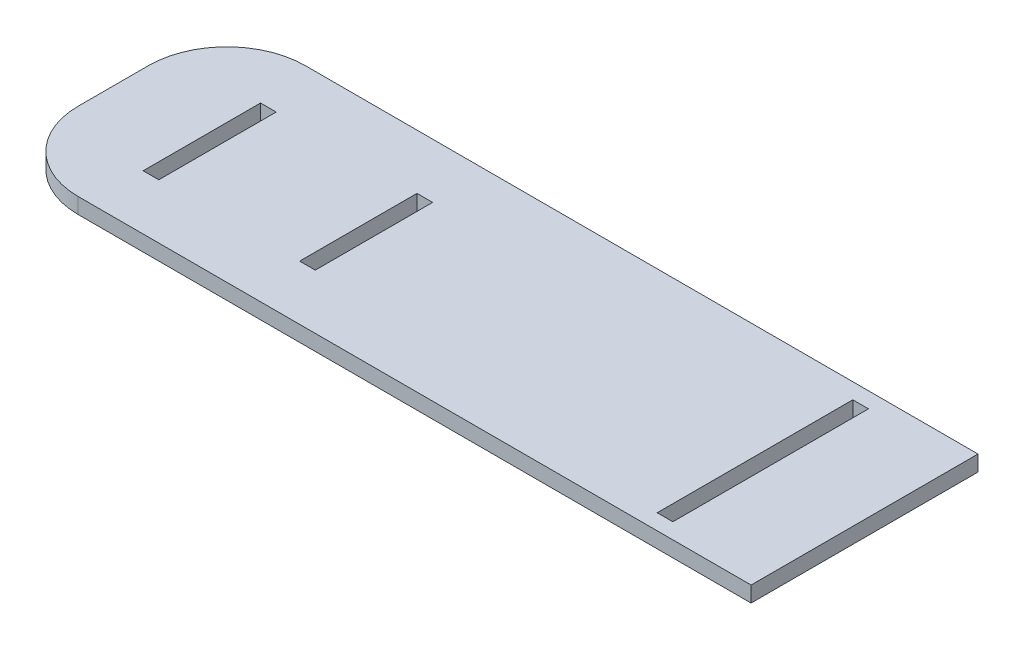
ISO-10303-21;
HEADER;
FILE_DESCRIPTION(('STEP AP214'),'2;1');
FILE_NAME('part.step','',(''),(''),'','','');
FILE_SCHEMA(('AUTOMOTIVE_DESIGN { 1 0 10303 214 1 1 1 1 }'));
ENDSEC;
DATA;
#1=APPLICATION_CONTEXT('core data for automotive mechanical design processes');
#2=APPLICATION_PROTOCOL_DEFINITION('international standard','automotive_design',2000,#1);
#3=PRODUCT_CONTEXT('',#1,'mechanical');
#4=PRODUCT('Part','Part','',(#3));
#5=PRODUCT_RELATED_PRODUCT_CATEGORY('part','',(#4));
#6=PRODUCT_DEFINITION_FORMATION('','',#4);
#7=PRODUCT_DEFINITION_CONTEXT('part definition',#1,'design');
#8=PRODUCT_DEFINITION('design','',#6,#7);
#9=PRODUCT_DEFINITION_SHAPE('','',#8);
#10=(LENGTH_UNIT() NAMED_UNIT(*) SI_UNIT(.MILLI.,.METRE.));
#11=(NAMED_UNIT(*) PLANE_ANGLE_UNIT() SI_UNIT($,.RADIAN.));
#12=(NAMED_UNIT(*) SI_UNIT($,.STERADIAN.) SOLID_ANGLE_UNIT());
#13=UNCERTAINTY_MEASURE_WITH_UNIT(LENGTH_MEASURE(1.E-05),#10,'distance_accuracy_value','');
#14=(GEOMETRIC_REPRESENTATION_CONTEXT(3) GLOBAL_UNCERTAINTY_ASSIGNED_CONTEXT((#13)) GLOBAL_UNIT_ASSIGNED_CONTEXT((#10,
#11,#12)) REPRESENTATION_CONTEXT('',''));
#15=CARTESIAN_POINT('',(0.,0.,0.));
#16=DIRECTION('',(0.,0.,1.));
#17=DIRECTION('',(1.,0.,0.));
#18=AXIS2_PLACEMENT_3D('',#15,#16,#17);
#19=CARTESIAN_POINT('',(0.,20.,145.));
#20=DIRECTION('',(-1.,0.,0.));
#21=DIRECTION('',(0.,0.,1.));
#22=AXIS2_PLACEMENT_3D('',#19,#20,#21);
#23=PLANE('',#22);
#24=DIRECTION('',(0.,0.,-1.));
#25=VECTOR('',#24,1.);
#26=CARTESIAN_POINT('',(0.,0.,145.));
#27=LINE('',#26,#25);
#28=CARTESIAN_POINT('',(0.,0.,145.));
#29=VERTEX_POINT('',#28);
#30=CARTESIAN_POINT('',(-1.54871412423962E-13,0.,-145.));
#31=VERTEX_POINT('',#30);
#32=EDGE_CURVE('E219',#29,#31,#27,.T.);
#33=ORIENTED_EDGE('',*,*,#32,.T.);
#34=DIRECTION('',(0.,-1.,0.));
#35=VECTOR('',#34,1.);
#36=CARTESIAN_POINT('',(-1.54871412423962E-13,20.,-145.));
#37=LINE('',#36,#35);
#38=CARTESIAN_POINT('',(-1.54871412423962E-13,20.,-145.));
#39=VERTEX_POINT('',#38);
#40=EDGE_CURVE('E339',#39,#31,#37,.T.);
#41=ORIENTED_EDGE('',*,*,#40,.F.);
#42=DIRECTION('',(0.,0.,-1.));
#43=VECTOR('',#42,1.);
#44=CARTESIAN_POINT('',(0.,20.,145.));
#45=LINE('',#44,#43);
#46=CARTESIAN_POINT('',(0.,20.,145.));
#47=VERTEX_POINT('',#46);
#48=EDGE_CURVE('E306',#47,#39,#45,.T.);
#49=ORIENTED_EDGE('',*,*,#48,.F.);
#50=DIRECTION('',(0.,-1.,0.));
#51=VECTOR('',#50,1.);
#52=CARTESIAN_POINT('',(0.,20.,145.));
#53=LINE('',#52,#51);
#54=EDGE_CURVE('E322',#47,#29,#53,.T.);
#55=ORIENTED_EDGE('',*,*,#54,.T.);
#56=EDGE_LOOP('',(#33,#41,#49,#55));
#57=FACE_BOUND('',#56,.T.);
#58=ADVANCED_FACE('F46',(#57),#23,.F.);
#59=CARTESIAN_POINT('',(-1.54871412423962E-13,20.,-145.));
#60=DIRECTION('',(0.,0.,1.));
#61=DIRECTION('',(1.,0.,0.));
#62=AXIS2_PLACEMENT_3D('',#59,#60,#61);
#63=PLANE('',#62);
#64=DIRECTION('',(-1.,0.,0.));
#65=VECTOR('',#64,1.);
#66=CARTESIAN_POINT('',(-1.54871412423962E-13,0.,-145.));
#67=LINE('',#66,#65);
#68=CARTESIAN_POINT('',(-860.,0.,-144.999999999999));
#69=VERTEX_POINT('',#68);
#70=EDGE_CURVE('E326',#31,#69,#67,.T.);
#71=ORIENTED_EDGE('',*,*,#70,.T.);
#72=DIRECTION('',(0.,-1.,0.));
#73=VECTOR('',#72,1.);
#74=CARTESIAN_POINT('',(-860.,20.,-144.999999999999));
#75=LINE('',#74,#73);
#76=CARTESIAN_POINT('',(-860.,20.,-144.999999999999));
#77=VERTEX_POINT('',#76);
#78=EDGE_CURVE('E356',#69,#77,#75,.F.);
#79=ORIENTED_EDGE('',*,*,#78,.T.);
#80=DIRECTION('',(-1.,0.,0.));
#81=VECTOR('',#80,1.);
#82=CARTESIAN_POINT('',(-1.54871412423962E-13,20.,-145.));
#83=LINE('',#82,#81);
#84=EDGE_CURVE('E310',#39,#77,#83,.T.);
#85=ORIENTED_EDGE('',*,*,#84,.F.);
#86=ORIENTED_EDGE('',*,*,#40,.T.);
#87=EDGE_LOOP('',(#71,#79,#85,#86));
#88=FACE_BOUND('',#87,.T.);
#89=ADVANCED_FACE('F378',(#88),#63,.F.);
#90=CARTESIAN_POINT('',(-960.,20.,-144.999999999999));
#91=DIRECTION('',(1.,0.,0.));
#92=DIRECTION('',(0.,0.,-1.));
#93=AXIS2_PLACEMENT_3D('',#90,#91,#92);
#94=PLANE('',#93);
#95=DIRECTION('',(0.,0.,1.));
#96=VECTOR('',#95,1.);
#97=CARTESIAN_POINT('',(-960.,20.,-144.999999999999));
#98=LINE('',#97,#96);
#99=CARTESIAN_POINT('',(-960.,20.,-44.9999999999994));
#100=VERTEX_POINT('',#99);
#101=CARTESIAN_POINT('',(-960.,20.,45.0000000000002));
#102=VERTEX_POINT('',#101);
#103=EDGE_CURVE('E315',#100,#102,#98,.T.);
#104=ORIENTED_EDGE('',*,*,#103,.F.);
#105=DIRECTION('',(0.,-1.,0.));
#106=VECTOR('',#105,1.);
#107=CARTESIAN_POINT('',(-960.,20.,-44.9999999999994));
#108=LINE('',#107,#106);
#109=CARTESIAN_POINT('',(-960.,0.,-44.9999999999994));
#110=VERTEX_POINT('',#109);
#111=EDGE_CURVE('E346',#100,#110,#108,.T.);
#112=ORIENTED_EDGE('',*,*,#111,.T.);
#113=DIRECTION('',(0.,0.,1.));
#114=VECTOR('',#113,1.);
#115=CARTESIAN_POINT('',(-960.,0.,-144.999999999999));
#116=LINE('',#115,#114);
#117=CARTESIAN_POINT('',(-960.,0.,45.0000000000002));
#118=VERTEX_POINT('',#117);
#119=EDGE_CURVE('E330',#110,#118,#116,.T.);
#120=ORIENTED_EDGE('',*,*,#119,.T.);
#121=DIRECTION('',(0.,-1.,0.));
#122=VECTOR('',#121,1.);
#123=CARTESIAN_POINT('',(-960.,20.,45.0000000000002));
#124=LINE('',#123,#122);
#125=EDGE_CURVE('E343',#118,#102,#124,.F.);
#126=ORIENTED_EDGE('',*,*,#125,.T.);
#127=EDGE_LOOP('',(#104,#112,#120,#126));
#128=FACE_BOUND('',#127,.T.);
#129=ADVANCED_FACE('F370',(#128),#94,.F.);
#130=CARTESIAN_POINT('',(-960.,20.,145.));
#131=DIRECTION('',(0.,0.,-1.));
#132=DIRECTION('',(-1.,0.,0.));
#133=AXIS2_PLACEMENT_3D('',#130,#131,#132);
#134=PLANE('',#133);
#135=DIRECTION('',(1.,0.,0.));
#136=VECTOR('',#135,1.);
#137=CARTESIAN_POINT('',(-960.,20.,145.));
#138=LINE('',#137,#136);
#139=CARTESIAN_POINT('',(-860.,20.,145.));
#140=VERTEX_POINT('',#139);
#141=EDGE_CURVE('E319',#140,#47,#138,.T.);
#142=ORIENTED_EDGE('',*,*,#141,.F.);
#143=DIRECTION('',(0.,-1.,0.));
#144=VECTOR('',#143,1.);
#145=CARTESIAN_POINT('',(-860.,20.,145.));
#146=LINE('',#145,#144);
#147=CARTESIAN_POINT('',(-860.,0.,145.));
#148=VERTEX_POINT('',#147);
#149=EDGE_CURVE('E11',#140,#148,#146,.T.);
#150=ORIENTED_EDGE('',*,*,#149,.T.);
#151=DIRECTION('',(1.,0.,0.));
#152=VECTOR('',#151,1.);
#153=CARTESIAN_POINT('',(-960.,0.,145.));
#154=LINE('',#153,#152);
#155=EDGE_CURVE('E311',#148,#29,#154,.T.);
#156=ORIENTED_EDGE('',*,*,#155,.T.);
#157=ORIENTED_EDGE('',*,*,#54,.F.);
#158=EDGE_LOOP('',(#142,#150,#156,#157));
#159=FACE_BOUND('',#158,.T.);
#160=ADVANCED_FACE('F386',(#159),#134,.F.);
#161=CARTESIAN_POINT('',(0.,20.,0.));
#162=DIRECTION('',(0.,1.,0.));
#163=DIRECTION('',(0.,0.,1.));
#164=AXIS2_PLACEMENT_3D('',#161,#162,#163);
#165=PLANE('',#164);
#166=DIRECTION('',(-1.,0.,0.));
#167=VECTOR('',#166,1.);
#168=CARTESIAN_POINT('',(-120.,20.,125.));
#169=LINE('',#168,#167);
#170=CARTESIAN_POINT('',(-120.,20.,125.));
#171=VERTEX_POINT('',#170);
#172=CARTESIAN_POINT('',(-140.,20.,125.));
#173=VERTEX_POINT('',#172);
#174=EDGE_CURVE('E186',#171,#173,#169,.T.);
#175=ORIENTED_EDGE('',*,*,#174,.T.);
#176=DIRECTION('',(0.,0.,-1.));
#177=VECTOR('',#176,1.);
#178=CARTESIAN_POINT('',(-140.,20.,125.));
#179=LINE('',#178,#177);
#180=CARTESIAN_POINT('',(-140.,20.,-125.));
#181=VERTEX_POINT('',#180);
#182=EDGE_CURVE('E172',#173,#181,#179,.T.);
#183=ORIENTED_EDGE('',*,*,#182,.T.);
#184=DIRECTION('',(1.,0.,0.));
#185=VECTOR('',#184,1.);
#186=CARTESIAN_POINT('',(-140.,20.,-125.));
#187=LINE('',#186,#185);
#188=CARTESIAN_POINT('',(-120.,20.,-125.));
#189=VERTEX_POINT('',#188);
#190=EDGE_CURVE('E209',#181,#189,#187,.T.);
#191=ORIENTED_EDGE('',*,*,#190,.T.);
#192=DIRECTION('',(0.,0.,1.));
#193=VECTOR('',#192,1.);
#194=CARTESIAN_POINT('',(-120.,20.,-125.));
#195=LINE('',#194,#193);
#196=EDGE_CURVE('E195',#189,#171,#195,.T.);
#197=ORIENTED_EDGE('',*,*,#196,.T.);
#198=EDGE_LOOP('',(#175,#183,#191,#197));
#199=FACE_BOUND('',#198,.T.);
#200=DIRECTION('',(1.,0.,0.));
#201=VECTOR('',#200,1.);
#202=CARTESIAN_POINT('',(-627.,20.,-75.));
#203=LINE('',#202,#201);
#204=CARTESIAN_POINT('',(-647.,20.,-75.));
#205=VERTEX_POINT('',#204);
#206=CARTESIAN_POINT('',(-627.,20.,-75.));
#207=VERTEX_POINT('',#206);
#208=EDGE_CURVE('E227',#205,#207,#203,.T.);
#209=ORIENTED_EDGE('',*,*,#208,.T.);
#210=DIRECTION('',(0.,0.,1.));
#211=VECTOR('',#210,1.);
#212=CARTESIAN_POINT('',(-627.,20.,75.));
#213=LINE('',#212,#211);
#214=CARTESIAN_POINT('',(-627.,20.,75.));
#215=VERTEX_POINT('',#214);
#216=EDGE_CURVE('E228',#207,#215,#213,.T.);
#217=ORIENTED_EDGE('',*,*,#216,.T.);
#218=DIRECTION('',(-1.,0.,0.));
#219=VECTOR('',#218,1.);
#220=CARTESIAN_POINT('',(-647.,20.,75.));
#221=LINE('',#220,#219);
#222=CARTESIAN_POINT('',(-647.,20.,75.));
#223=VERTEX_POINT('',#222);
#224=EDGE_CURVE('E232',#215,#223,#221,.T.);
#225=ORIENTED_EDGE('',*,*,#224,.T.);
#226=DIRECTION('',(0.,0.,-1.));
#227=VECTOR('',#226,1.);
#228=CARTESIAN_POINT('',(-647.,20.,-75.));
#229=LINE('',#228,#227);
#230=EDGE_CURVE('E222',#223,#205,#229,.T.);
#231=ORIENTED_EDGE('',*,*,#230,.T.);
#232=EDGE_LOOP('',(#209,#217,#225,#231));
#233=FACE_BOUND('',#232,.T.);
#234=DIRECTION('',(-1.,0.,0.));
#235=VECTOR('',#234,1.);
#236=CARTESIAN_POINT('',(-827.,20.,75.));
#237=LINE('',#236,#235);
#238=CARTESIAN_POINT('',(-827.,20.,75.));
#239=VERTEX_POINT('',#238);
#240=CARTESIAN_POINT('',(-847.,20.,75.));
#241=VERTEX_POINT('',#240);
#242=EDGE_CURVE('E270',#239,#241,#237,.T.);
#243=ORIENTED_EDGE('',*,*,#242,.T.);
#244=DIRECTION('',(0.,0.,-1.));
#245=VECTOR('',#244,1.);
#246=CARTESIAN_POINT('',(-847.,20.,75.));
#247=LINE('',#246,#245);
#248=CARTESIAN_POINT('',(-847.,20.,-75.));
#249=VERTEX_POINT('',#248);
#250=EDGE_CURVE('E271',#241,#249,#247,.T.);
#251=ORIENTED_EDGE('',*,*,#250,.T.);
#252=DIRECTION('',(1.,0.,0.));
#253=VECTOR('',#252,1.);
#254=CARTESIAN_POINT('',(-847.,20.,-75.));
#255=LINE('',#254,#253);
#256=CARTESIAN_POINT('',(-827.,20.,-75.));
#257=VERTEX_POINT('',#256);
#258=EDGE_CURVE('E275',#249,#257,#255,.T.);
#259=ORIENTED_EDGE('',*,*,#258,.T.);
#260=DIRECTION('',(0.,0.,1.));
#261=VECTOR('',#260,1.);
#262=CARTESIAN_POINT('',(-827.,20.,-75.));
#263=LINE('',#262,#261);
#264=EDGE_CURVE('E266',#257,#239,#263,.T.);
#265=ORIENTED_EDGE('',*,*,#264,.T.);
#266=EDGE_LOOP('',(#243,#251,#259,#265));
#267=FACE_BOUND('',#266,.T.);
#268=ORIENTED_EDGE('',*,*,#84,.T.);
#269=CARTESIAN_POINT('',(-860.,20.,-44.9999999999994));
#270=DIRECTION('',(0.,1.,0.));
#271=DIRECTION('',(0.,0.,1.));
#272=AXIS2_PLACEMENT_3D('',#269,#270,#271);
#273=CIRCLE('',#272,100.);
#274=EDGE_CURVE('E55',#77,#100,#273,.T.);
#275=ORIENTED_EDGE('',*,*,#274,.T.);
#276=ORIENTED_EDGE('',*,*,#103,.T.);
#277=CARTESIAN_POINT('',(-860.,20.,45.0000000000002));
#278=DIRECTION('',(0.,1.,0.));
#279=DIRECTION('',(0.,0.,1.));
#280=AXIS2_PLACEMENT_3D('',#277,#278,#279);
#281=CIRCLE('',#280,100.);
#282=EDGE_CURVE('E359',#102,#140,#281,.T.);
#283=ORIENTED_EDGE('',*,*,#282,.T.);
#284=ORIENTED_EDGE('',*,*,#141,.T.);
#285=ORIENTED_EDGE('',*,*,#48,.T.);
#286=EDGE_LOOP('',(#268,#275,#276,#283,#284,#285));
#287=FACE_BOUND('',#286,.T.);
#288=ADVANCED_FACE('F193',(#199,#233,#267,#287),#165,.T.);
#289=CARTESIAN_POINT('',(0.,0.,0.));
#290=DIRECTION('',(0.,1.,0.));
#291=DIRECTION('',(0.,0.,1.));
#292=AXIS2_PLACEMENT_3D('',#289,#290,#291);
#293=PLANE('',#292);
#294=DIRECTION('',(0.,0.,-1.));
#295=VECTOR('',#294,1.);
#296=CARTESIAN_POINT('',(-140.,0.,125.));
#297=LINE('',#296,#295);
#298=CARTESIAN_POINT('',(-140.,0.,125.));
#299=VERTEX_POINT('',#298);
#300=CARTESIAN_POINT('',(-140.,0.,-125.));
#301=VERTEX_POINT('',#300);
#302=EDGE_CURVE('E200',#299,#301,#297,.T.);
#303=ORIENTED_EDGE('',*,*,#302,.F.);
#304=DIRECTION('',(-1.,0.,0.));
#305=VECTOR('',#304,1.);
#306=CARTESIAN_POINT('',(-120.,0.,125.));
#307=LINE('',#306,#305);
#308=CARTESIAN_POINT('',(-120.,0.,125.));
#309=VERTEX_POINT('',#308);
#310=EDGE_CURVE('E189',#309,#299,#307,.T.);
#311=ORIENTED_EDGE('',*,*,#310,.F.);
#312=DIRECTION('',(0.,0.,1.));
#313=VECTOR('',#312,1.);
#314=CARTESIAN_POINT('',(-120.,0.,-125.));
#315=LINE('',#314,#313);
#316=CARTESIAN_POINT('',(-120.,0.,-125.));
#317=VERTEX_POINT('',#316);
#318=EDGE_CURVE('E204',#317,#309,#315,.T.);
#319=ORIENTED_EDGE('',*,*,#318,.F.);
#320=DIRECTION('',(1.,0.,0.));
#321=VECTOR('',#320,1.);
#322=CARTESIAN_POINT('',(-140.,0.,-125.));
#323=LINE('',#322,#321);
#324=EDGE_CURVE('E197',#301,#317,#323,.T.);
#325=ORIENTED_EDGE('',*,*,#324,.F.);
#326=EDGE_LOOP('',(#303,#311,#319,#325));
#327=FACE_BOUND('',#326,.T.);
#328=DIRECTION('',(0.,0.,1.));
#329=VECTOR('',#328,1.);
#330=CARTESIAN_POINT('',(-627.,0.,75.));
#331=LINE('',#330,#329);
#332=CARTESIAN_POINT('',(-627.,0.,-75.));
#333=VERTEX_POINT('',#332);
#334=CARTESIAN_POINT('',(-627.,0.,75.));
#335=VERTEX_POINT('',#334);
#336=EDGE_CURVE('E257',#333,#335,#331,.T.);
#337=ORIENTED_EDGE('',*,*,#336,.F.);
#338=DIRECTION('',(1.,0.,0.));
#339=VECTOR('',#338,1.);
#340=CARTESIAN_POINT('',(-627.,0.,-75.));
#341=LINE('',#340,#339);
#342=CARTESIAN_POINT('',(-647.,0.,-75.));
#343=VERTEX_POINT('',#342);
#344=EDGE_CURVE('E253',#343,#333,#341,.T.);
#345=ORIENTED_EDGE('',*,*,#344,.F.);
#346=DIRECTION('',(0.,0.,-1.));
#347=VECTOR('',#346,1.);
#348=CARTESIAN_POINT('',(-647.,0.,-75.));
#349=LINE('',#348,#347);
#350=CARTESIAN_POINT('',(-647.,0.,75.));
#351=VERTEX_POINT('',#350);
#352=EDGE_CURVE('E250',#351,#343,#349,.T.);
#353=ORIENTED_EDGE('',*,*,#352,.F.);
#354=DIRECTION('',(-1.,0.,0.));
#355=VECTOR('',#354,1.);
#356=CARTESIAN_POINT('',(-647.,0.,75.));
#357=LINE('',#356,#355);
#358=EDGE_CURVE('E249',#335,#351,#357,.T.);
#359=ORIENTED_EDGE('',*,*,#358,.F.);
#360=EDGE_LOOP('',(#337,#345,#353,#359));
#361=FACE_BOUND('',#360,.T.);
#362=DIRECTION('',(0.,0.,-1.));
#363=VECTOR('',#362,1.);
#364=CARTESIAN_POINT('',(-847.,0.,75.));
#365=LINE('',#364,#363);
#366=CARTESIAN_POINT('',(-847.,0.,75.));
#367=VERTEX_POINT('',#366);
#368=CARTESIAN_POINT('',(-847.,0.,-75.));
#369=VERTEX_POINT('',#368);
#370=EDGE_CURVE('E300',#367,#369,#365,.T.);
#371=ORIENTED_EDGE('',*,*,#370,.F.);
#372=DIRECTION('',(-1.,0.,0.));
#373=VECTOR('',#372,1.);
#374=CARTESIAN_POINT('',(-827.,0.,75.));
#375=LINE('',#374,#373);
#376=CARTESIAN_POINT('',(-827.,0.,75.));
#377=VERTEX_POINT('',#376);
#378=EDGE_CURVE('E296',#377,#367,#375,.T.);
#379=ORIENTED_EDGE('',*,*,#378,.F.);
#380=DIRECTION('',(0.,0.,1.));
#381=VECTOR('',#380,1.);
#382=CARTESIAN_POINT('',(-827.,0.,-75.));
#383=LINE('',#382,#381);
#384=CARTESIAN_POINT('',(-827.,0.,-75.));
#385=VERTEX_POINT('',#384);
#386=EDGE_CURVE('E223',#385,#377,#383,.T.);
#387=ORIENTED_EDGE('',*,*,#386,.F.);
#388=DIRECTION('',(1.,0.,0.));
#389=VECTOR('',#388,1.);
#390=CARTESIAN_POINT('',(-847.,0.,-75.));
#391=LINE('',#390,#389);
#392=EDGE_CURVE('E292',#369,#385,#391,.T.);
#393=ORIENTED_EDGE('',*,*,#392,.F.);
#394=EDGE_LOOP('',(#371,#379,#387,#393));
#395=FACE_BOUND('',#394,.T.);
#396=ORIENTED_EDGE('',*,*,#119,.F.);
#397=CARTESIAN_POINT('',(-860.,0.,-44.9999999999994));
#398=DIRECTION('',(0.,1.,0.));
#399=DIRECTION('',(0.,0.,1.));
#400=AXIS2_PLACEMENT_3D('',#397,#398,#399);
#401=CIRCLE('',#400,100.);
#402=EDGE_CURVE('E353',#110,#69,#401,.F.);
#403=ORIENTED_EDGE('',*,*,#402,.T.);
#404=ORIENTED_EDGE('',*,*,#70,.F.);
#405=ORIENTED_EDGE('',*,*,#32,.F.);
#406=ORIENTED_EDGE('',*,*,#155,.F.);
#407=CARTESIAN_POINT('',(-860.,0.,45.0000000000002));
#408=DIRECTION('',(0.,1.,0.));
#409=DIRECTION('',(0.,0.,1.));
#410=AXIS2_PLACEMENT_3D('',#407,#408,#409);
#411=CIRCLE('',#410,100.);
#412=EDGE_CURVE('E350',#148,#118,#411,.F.);
#413=ORIENTED_EDGE('',*,*,#412,.T.);
#414=EDGE_LOOP('',(#396,#403,#404,#405,#406,#413));
#415=FACE_BOUND('',#414,.T.);
#416=ADVANCED_FACE('F375',(#327,#361,#395,#415),#293,.F.);
#417=CARTESIAN_POINT('',(-860.,20.,-44.9999999999994));
#418=DIRECTION('',(0.,-1.,0.));
#419=DIRECTION('',(0.,0.,-1.));
#420=AXIS2_PLACEMENT_3D('',#417,#418,#419);
#421=CYLINDRICAL_SURFACE('',#420,100.);
#422=ORIENTED_EDGE('',*,*,#274,.F.);
#423=ORIENTED_EDGE('',*,*,#78,.F.);
#424=ORIENTED_EDGE('',*,*,#402,.F.);
#425=ORIENTED_EDGE('',*,*,#111,.F.);
#426=EDGE_LOOP('',(#422,#423,#424,#425));
#427=FACE_BOUND('',#426,.T.);
#428=ADVANCED_FACE('F373',(#427),#421,.T.);
#429=CARTESIAN_POINT('',(-860.,20.,45.0000000000002));
#430=DIRECTION('',(0.,-1.,0.));
#431=DIRECTION('',(0.,0.,-1.));
#432=AXIS2_PLACEMENT_3D('',#429,#430,#431);
#433=CYLINDRICAL_SURFACE('',#432,100.);
#434=ORIENTED_EDGE('',*,*,#282,.F.);
#435=ORIENTED_EDGE('',*,*,#125,.F.);
#436=ORIENTED_EDGE('',*,*,#412,.F.);
#437=ORIENTED_EDGE('',*,*,#149,.F.);
#438=EDGE_LOOP('',(#434,#435,#436,#437));
#439=FACE_BOUND('',#438,.T.);
#440=ADVANCED_FACE('F48',(#439),#433,.T.);
#441=CARTESIAN_POINT('',(-827.,270.798724079689,75.));
#442=DIRECTION('',(0.,0.,1.));
#443=DIRECTION('',(1.,0.,0.));
#444=AXIS2_PLACEMENT_3D('',#441,#442,#443);
#445=PLANE('',#444);
#446=DIRECTION('',(0.,-1.,0.));
#447=VECTOR('',#446,1.);
#448=CARTESIAN_POINT('',(-827.,270.798724079689,75.));
#449=LINE('',#448,#447);
#450=EDGE_CURVE('E263',#239,#377,#449,.T.);
#451=ORIENTED_EDGE('',*,*,#450,.T.);
#452=ORIENTED_EDGE('',*,*,#378,.T.);
#453=DIRECTION('',(0.,-1.,0.));
#454=VECTOR('',#453,1.);
#455=CARTESIAN_POINT('',(-847.,270.798724079689,75.));
#456=LINE('',#455,#454);
#457=EDGE_CURVE('E267',#241,#367,#456,.T.);
#458=ORIENTED_EDGE('',*,*,#457,.F.);
#459=ORIENTED_EDGE('',*,*,#242,.F.);
#460=EDGE_LOOP('',(#451,#452,#458,#459));
#461=FACE_BOUND('',#460,.T.);
#462=ADVANCED_FACE('F390',(#461),#445,.F.);
#463=CARTESIAN_POINT('',(-847.,270.798724079689,75.));
#464=DIRECTION('',(-1.,0.,0.));
#465=DIRECTION('',(0.,0.,1.));
#466=AXIS2_PLACEMENT_3D('',#463,#464,#465);
#467=PLANE('',#466);
#468=ORIENTED_EDGE('',*,*,#457,.T.);
#469=ORIENTED_EDGE('',*,*,#370,.T.);
#470=DIRECTION('',(0.,-1.,0.));
#471=VECTOR('',#470,1.);
#472=CARTESIAN_POINT('',(-847.,270.798724079689,-75.));
#473=LINE('',#472,#471);
#474=EDGE_CURVE('E272',#249,#369,#473,.T.);
#475=ORIENTED_EDGE('',*,*,#474,.F.);
#476=ORIENTED_EDGE('',*,*,#250,.F.);
#477=EDGE_LOOP('',(#468,#469,#475,#476));
#478=FACE_BOUND('',#477,.T.);
#479=ADVANCED_FACE('F396',(#478),#467,.F.);
#480=CARTESIAN_POINT('',(-847.,270.798724079689,-75.));
#481=DIRECTION('',(0.,0.,-1.));
#482=DIRECTION('',(-1.,0.,0.));
#483=AXIS2_PLACEMENT_3D('',#480,#481,#482);
#484=PLANE('',#483);
#485=ORIENTED_EDGE('',*,*,#474,.T.);
#486=ORIENTED_EDGE('',*,*,#392,.T.);
#487=DIRECTION('',(0.,-1.,0.));
#488=VECTOR('',#487,1.);
#489=CARTESIAN_POINT('',(-827.,270.798724079689,-75.));
#490=LINE('',#489,#488);
#491=EDGE_CURVE('E276',#257,#385,#490,.T.);
#492=ORIENTED_EDGE('',*,*,#491,.F.);
#493=ORIENTED_EDGE('',*,*,#258,.F.);
#494=EDGE_LOOP('',(#485,#486,#492,#493));
#495=FACE_BOUND('',#494,.T.);
#496=ADVANCED_FACE('F418',(#495),#484,.F.);
#497=CARTESIAN_POINT('',(-827.,270.798724079689,-75.));
#498=DIRECTION('',(1.,0.,0.));
#499=DIRECTION('',(0.,0.,-1.));
#500=AXIS2_PLACEMENT_3D('',#497,#498,#499);
#501=PLANE('',#500);
#502=ORIENTED_EDGE('',*,*,#491,.T.);
#503=ORIENTED_EDGE('',*,*,#386,.T.);
#504=ORIENTED_EDGE('',*,*,#450,.F.);
#505=ORIENTED_EDGE('',*,*,#264,.F.);
#506=EDGE_LOOP('',(#502,#503,#504,#505));
#507=FACE_BOUND('',#506,.T.);
#508=ADVANCED_FACE('F414',(#507),#501,.F.);
#509=CARTESIAN_POINT('',(-627.,270.798724079689,-75.));
#510=DIRECTION('',(0.,0.,-1.));
#511=DIRECTION('',(-1.,0.,0.));
#512=AXIS2_PLACEMENT_3D('',#509,#510,#511);
#513=PLANE('',#512);
#514=DIRECTION('',(0.,-1.,0.));
#515=VECTOR('',#514,1.);
#516=CARTESIAN_POINT('',(-647.,270.798724079689,-75.));
#517=LINE('',#516,#515);
#518=EDGE_CURVE('E70',#205,#343,#517,.T.);
#519=ORIENTED_EDGE('',*,*,#518,.T.);
#520=ORIENTED_EDGE('',*,*,#344,.T.);
#521=DIRECTION('',(0.,-1.,0.));
#522=VECTOR('',#521,1.);
#523=CARTESIAN_POINT('',(-627.,270.798724079689,-75.));
#524=LINE('',#523,#522);
#525=EDGE_CURVE('E224',#207,#333,#524,.T.);
#526=ORIENTED_EDGE('',*,*,#525,.F.);
#527=ORIENTED_EDGE('',*,*,#208,.F.);
#528=EDGE_LOOP('',(#519,#520,#526,#527));
#529=FACE_BOUND('',#528,.T.);
#530=ADVANCED_FACE('F417',(#529),#513,.F.);
#531=CARTESIAN_POINT('',(-627.,270.798724079689,75.));
#532=DIRECTION('',(1.,0.,0.));
#533=DIRECTION('',(0.,0.,-1.));
#534=AXIS2_PLACEMENT_3D('',#531,#532,#533);
#535=PLANE('',#534);
#536=ORIENTED_EDGE('',*,*,#525,.T.);
#537=ORIENTED_EDGE('',*,*,#336,.T.);
#538=DIRECTION('',(0.,-1.,0.));
#539=VECTOR('',#538,1.);
#540=CARTESIAN_POINT('',(-627.,270.798724079689,75.));
#541=LINE('',#540,#539);
#542=EDGE_CURVE('E229',#215,#335,#541,.T.);
#543=ORIENTED_EDGE('',*,*,#542,.F.);
#544=ORIENTED_EDGE('',*,*,#216,.F.);
#545=EDGE_LOOP('',(#536,#537,#543,#544));
#546=FACE_BOUND('',#545,.T.);
#547=ADVANCED_FACE('F432',(#546),#535,.F.);
#548=CARTESIAN_POINT('',(-647.,270.798724079689,75.));
#549=DIRECTION('',(0.,0.,1.));
#550=DIRECTION('',(1.,0.,0.));
#551=AXIS2_PLACEMENT_3D('',#548,#549,#550);
#552=PLANE('',#551);
#553=ORIENTED_EDGE('',*,*,#542,.T.);
#554=ORIENTED_EDGE('',*,*,#358,.T.);
#555=DIRECTION('',(0.,-1.,0.));
#556=VECTOR('',#555,1.);
#557=CARTESIAN_POINT('',(-647.,270.798724079689,75.));
#558=LINE('',#557,#556);
#559=EDGE_CURVE('E233',#223,#351,#558,.T.);
#560=ORIENTED_EDGE('',*,*,#559,.F.);
#561=ORIENTED_EDGE('',*,*,#224,.F.);
#562=EDGE_LOOP('',(#553,#554,#560,#561));
#563=FACE_BOUND('',#562,.T.);
#564=ADVANCED_FACE('F429',(#563),#552,.F.);
#565=CARTESIAN_POINT('',(-647.,270.798724079689,-75.));
#566=DIRECTION('',(-1.,0.,0.));
#567=DIRECTION('',(0.,0.,1.));
#568=AXIS2_PLACEMENT_3D('',#565,#566,#567);
#569=PLANE('',#568);
#570=ORIENTED_EDGE('',*,*,#559,.T.);
#571=ORIENTED_EDGE('',*,*,#352,.T.);
#572=ORIENTED_EDGE('',*,*,#518,.F.);
#573=ORIENTED_EDGE('',*,*,#230,.F.);
#574=EDGE_LOOP('',(#570,#571,#572,#573));
#575=FACE_BOUND('',#574,.T.);
#576=ADVANCED_FACE('F426',(#575),#569,.F.);
#577=CARTESIAN_POINT('',(-120.,270.798724079689,125.));
#578=DIRECTION('',(0.,0.,1.));
#579=DIRECTION('',(1.,0.,0.));
#580=AXIS2_PLACEMENT_3D('',#577,#578,#579);
#581=PLANE('',#580);
#582=DIRECTION('',(0.,-1.,0.));
#583=VECTOR('',#582,1.);
#584=CARTESIAN_POINT('',(-120.,270.798724079689,125.));
#585=LINE('',#584,#583);
#586=EDGE_CURVE('E62',#171,#309,#585,.T.);
#587=ORIENTED_EDGE('',*,*,#586,.T.);
#588=ORIENTED_EDGE('',*,*,#310,.T.);
#589=DIRECTION('',(0.,-1.,0.));
#590=VECTOR('',#589,1.);
#591=CARTESIAN_POINT('',(-140.,270.798724079689,125.));
#592=LINE('',#591,#590);
#593=EDGE_CURVE('E176',#173,#299,#592,.T.);
#594=ORIENTED_EDGE('',*,*,#593,.F.);
#595=ORIENTED_EDGE('',*,*,#174,.F.);
#596=EDGE_LOOP('',(#587,#588,#594,#595));
#597=FACE_BOUND('',#596,.T.);
#598=ADVANCED_FACE('F185',(#597),#581,.F.);
#599=CARTESIAN_POINT('',(-140.,270.798724079689,125.));
#600=DIRECTION('',(-1.,0.,0.));
#601=DIRECTION('',(0.,0.,1.));
#602=AXIS2_PLACEMENT_3D('',#599,#600,#601);
#603=PLANE('',#602);
#604=ORIENTED_EDGE('',*,*,#593,.T.);
#605=ORIENTED_EDGE('',*,*,#302,.T.);
#606=DIRECTION('',(0.,-1.,0.));
#607=VECTOR('',#606,1.);
#608=CARTESIAN_POINT('',(-140.,270.798724079689,-125.));
#609=LINE('',#608,#607);
#610=EDGE_CURVE('E178',#181,#301,#609,.T.);
#611=ORIENTED_EDGE('',*,*,#610,.F.);
#612=ORIENTED_EDGE('',*,*,#182,.F.);
#613=EDGE_LOOP('',(#604,#605,#611,#612));
#614=FACE_BOUND('',#613,.T.);
#615=ADVANCED_FACE('F174',(#614),#603,.F.);
#616=CARTESIAN_POINT('',(-140.,270.798724079689,-125.));
#617=DIRECTION('',(0.,0.,-1.));
#618=DIRECTION('',(-1.,0.,0.));
#619=AXIS2_PLACEMENT_3D('',#616,#617,#618);
#620=PLANE('',#619);
#621=ORIENTED_EDGE('',*,*,#610,.T.);
#622=ORIENTED_EDGE('',*,*,#324,.T.);
#623=DIRECTION('',(0.,-1.,0.));
#624=VECTOR('',#623,1.);
#625=CARTESIAN_POINT('',(-120.,270.798724079689,-125.));
#626=LINE('',#625,#624);
#627=EDGE_CURVE('E208',#189,#317,#626,.T.);
#628=ORIENTED_EDGE('',*,*,#627,.F.);
#629=ORIENTED_EDGE('',*,*,#190,.F.);
#630=EDGE_LOOP('',(#621,#622,#628,#629));
#631=FACE_BOUND('',#630,.T.);
#632=ADVANCED_FACE('F444',(#631),#620,.F.);
#633=CARTESIAN_POINT('',(-120.,270.798724079689,-125.));
#634=DIRECTION('',(1.,0.,0.));
#635=DIRECTION('',(0.,0.,-1.));
#636=AXIS2_PLACEMENT_3D('',#633,#634,#635);
#637=PLANE('',#636);
#638=ORIENTED_EDGE('',*,*,#627,.T.);
#639=ORIENTED_EDGE('',*,*,#318,.T.);
#640=ORIENTED_EDGE('',*,*,#586,.F.);
#641=ORIENTED_EDGE('',*,*,#196,.F.);
#642=EDGE_LOOP('',(#638,#639,#640,#641));
#643=FACE_BOUND('',#642,.T.);
#644=ADVANCED_FACE('F447',(#643),#637,.F.);
#645=CLOSED_SHELL('',(#58,#89,#129,#160,#288,#416,#428,#440,#462,#479,#496,#508,#530,#547,#564,
#576,#598,#615,#632,#644));
#646=MANIFOLD_SOLID_BREP('B2',#645);
#647=ADVANCED_BREP_SHAPE_REPRESENTATION('',(#18,#646),#14);
#648=SHAPE_DEFINITION_REPRESENTATION(#9,#647);
ENDSEC;
END-ISO-10303-21;
